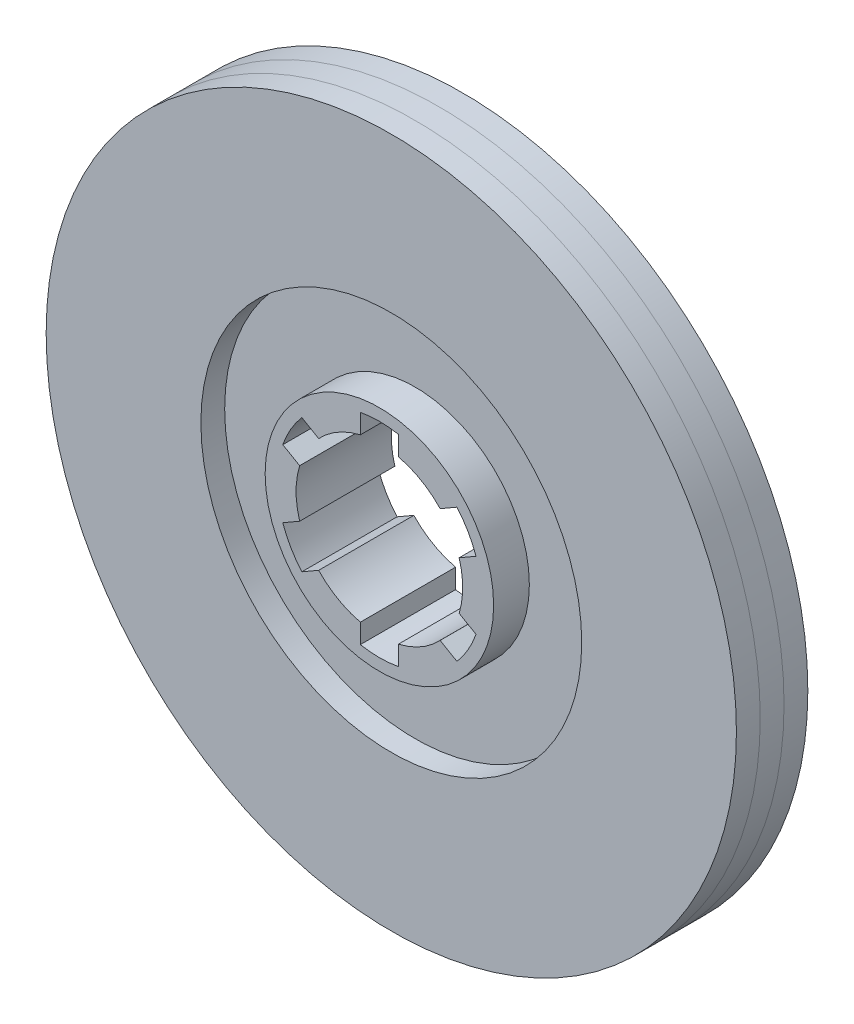
ISO-10303-21;
HEADER;
FILE_DESCRIPTION(('STEP AP214'),'2;1');
FILE_NAME('part.step','',(''),(''),'','','');
FILE_SCHEMA(('AUTOMOTIVE_DESIGN { 1 0 10303 214 1 1 1 1 }'));
ENDSEC;
DATA;
#1=APPLICATION_CONTEXT('core data for automotive mechanical design processes');
#2=APPLICATION_PROTOCOL_DEFINITION('international standard','automotive_design',2000,#1);
#3=PRODUCT_CONTEXT('',#1,'mechanical');
#4=PRODUCT('Part','Part','',(#3));
#5=PRODUCT_RELATED_PRODUCT_CATEGORY('part','',(#4));
#6=PRODUCT_DEFINITION_FORMATION('','',#4);
#7=PRODUCT_DEFINITION_CONTEXT('part definition',#1,'design');
#8=PRODUCT_DEFINITION('design','',#6,#7);
#9=PRODUCT_DEFINITION_SHAPE('','',#8);
#10=(LENGTH_UNIT() NAMED_UNIT(*) SI_UNIT(.MILLI.,.METRE.));
#11=(NAMED_UNIT(*) PLANE_ANGLE_UNIT() SI_UNIT($,.RADIAN.));
#12=(NAMED_UNIT(*) SI_UNIT($,.STERADIAN.) SOLID_ANGLE_UNIT());
#13=UNCERTAINTY_MEASURE_WITH_UNIT(LENGTH_MEASURE(1.E-05),#10,'distance_accuracy_value','');
#14=(GEOMETRIC_REPRESENTATION_CONTEXT(3) GLOBAL_UNCERTAINTY_ASSIGNED_CONTEXT((#13)) GLOBAL_UNIT_ASSIGNED_CONTEXT((#10,
#11,#12)) REPRESENTATION_CONTEXT('',''));
#15=CARTESIAN_POINT('',(0.,0.,0.));
#16=DIRECTION('',(0.,0.,1.));
#17=DIRECTION('',(1.,0.,0.));
#18=AXIS2_PLACEMENT_3D('',#15,#16,#17);
#19=CARTESIAN_POINT('',(0.,0.,-7.5));
#20=DIRECTION('',(0.,0.,-1.));
#21=DIRECTION('',(1.,0.,0.));
#22=AXIS2_PLACEMENT_3D('',#19,#20,#21);
#23=PLANE('',#22);
#24=CARTESIAN_POINT('',(0.,0.,-7.5));
#25=DIRECTION('',(0.,0.,1.));
#26=DIRECTION('',(1.,0.,0.));
#27=AXIS2_PLACEMENT_3D('',#24,#25,#26);
#28=CIRCLE('',#27,72.5);
#29=CARTESIAN_POINT('',(72.5,0.,-7.5));
#30=VERTEX_POINT('',#29);
#31=EDGE_CURVE('E13',#30,#30,#28,.T.);
#32=ORIENTED_EDGE('',*,*,#31,.F.);
#33=EDGE_LOOP('',(#32));
#34=FACE_BOUND('',#33,.T.);
#35=CARTESIAN_POINT('',(0.,0.,-7.5));
#36=DIRECTION('',(0.,0.,1.));
#37=DIRECTION('',(1.,0.,0.));
#38=AXIS2_PLACEMENT_3D('',#35,#36,#37);
#39=CIRCLE('',#38,40.);
#40=CARTESIAN_POINT('',(40.,0.,-7.5));
#41=VERTEX_POINT('',#40);
#42=EDGE_CURVE('E71',#41,#41,#39,.T.);
#43=ORIENTED_EDGE('',*,*,#42,.T.);
#44=EDGE_LOOP('',(#43));
#45=FACE_BOUND('',#44,.T.);
#46=ADVANCED_FACE('F60',(#34,#45),#23,.T.);
#47=CARTESIAN_POINT('',(0.,0.,-2.5));
#48=DIRECTION('',(0.,0.,-1.));
#49=DIRECTION('',(1.,0.,0.));
#50=AXIS2_PLACEMENT_3D('',#47,#48,#49);
#51=PLANE('',#50);
#52=CARTESIAN_POINT('',(0.,0.,-2.5));
#53=DIRECTION('',(0.,0.,1.));
#54=DIRECTION('',(1.,0.,0.));
#55=AXIS2_PLACEMENT_3D('',#52,#53,#54);
#56=CIRCLE('',#55,72.5);
#57=CARTESIAN_POINT('',(72.5,0.,-2.5));
#58=VERTEX_POINT('',#57);
#59=EDGE_CURVE('E64',#58,#58,#56,.T.);
#60=ORIENTED_EDGE('',*,*,#59,.T.);
#61=EDGE_LOOP('',(#60));
#62=FACE_BOUND('',#61,.T.);
#63=CARTESIAN_POINT('',(0.,0.,-2.5));
#64=DIRECTION('',(0.,0.,1.));
#65=DIRECTION('',(1.,0.,0.));
#66=AXIS2_PLACEMENT_3D('',#63,#64,#65);
#67=CIRCLE('',#66,40.);
#68=CARTESIAN_POINT('',(40.,0.,-2.5));
#69=VERTEX_POINT('',#68);
#70=EDGE_CURVE('E73',#69,#69,#67,.T.);
#71=ORIENTED_EDGE('',*,*,#70,.F.);
#72=EDGE_LOOP('',(#71));
#73=FACE_BOUND('',#72,.T.);
#74=ADVANCED_FACE('F86',(#62,#73),#51,.F.);
#75=CARTESIAN_POINT('',(0.,0.,-7.5));
#76=DIRECTION('',(0.,0.,1.));
#77=DIRECTION('',(-1.,0.,0.));
#78=AXIS2_PLACEMENT_3D('',#75,#76,#77);
#79=CYLINDRICAL_SURFACE('',#78,72.5);
#80=ORIENTED_EDGE('',*,*,#31,.T.);
#81=EDGE_LOOP('',(#80));
#82=FACE_BOUND('',#81,.T.);
#83=ORIENTED_EDGE('',*,*,#59,.F.);
#84=EDGE_LOOP('',(#83));
#85=FACE_BOUND('',#84,.T.);
#86=ADVANCED_FACE('F62',(#82,#85),#79,.T.);
#87=CARTESIAN_POINT('',(0.,0.,-7.5));
#88=DIRECTION('',(0.,0.,1.));
#89=DIRECTION('',(-1.,0.,0.));
#90=AXIS2_PLACEMENT_3D('',#87,#88,#89);
#91=CYLINDRICAL_SURFACE('',#90,40.);
#92=ORIENTED_EDGE('',*,*,#42,.F.);
#93=EDGE_LOOP('',(#92));
#94=FACE_BOUND('',#93,.T.);
#95=ORIENTED_EDGE('',*,*,#70,.T.);
#96=EDGE_LOOP('',(#95));
#97=FACE_BOUND('',#96,.T.);
#98=ADVANCED_FACE('F80',(#94,#97),#91,.F.);
#99=CLOSED_SHELL('',(#46,#74,#86,#98));
#100=MANIFOLD_SOLID_BREP('B2',#99);
#101=CARTESIAN_POINT('',(0.,0.,7.5));
#102=DIRECTION('',(0.,0.,1.));
#103=DIRECTION('',(1.,0.,0.));
#104=AXIS2_PLACEMENT_3D('',#101,#102,#103);
#105=PLANE('',#104);
#106=CARTESIAN_POINT('',(0.,0.,7.5));
#107=DIRECTION('',(0.,0.,1.));
#108=DIRECTION('',(1.,0.,0.));
#109=AXIS2_PLACEMENT_3D('',#106,#107,#108);
#110=CIRCLE('',#109,72.5);
#111=CARTESIAN_POINT('',(72.5,0.,7.5));
#112=VERTEX_POINT('',#111);
#113=EDGE_CURVE('E59',#112,#112,#110,.T.);
#114=ORIENTED_EDGE('',*,*,#113,.T.);
#115=EDGE_LOOP('',(#114));
#116=FACE_BOUND('',#115,.T.);
#117=CARTESIAN_POINT('',(0.,0.,7.5));
#118=DIRECTION('',(0.,0.,1.));
#119=DIRECTION('',(1.,0.,0.));
#120=AXIS2_PLACEMENT_3D('',#117,#118,#119);
#121=CIRCLE('',#120,40.);
#122=CARTESIAN_POINT('',(40.,0.,7.5));
#123=VERTEX_POINT('',#122);
#124=EDGE_CURVE('E168',#123,#123,#121,.T.);
#125=ORIENTED_EDGE('',*,*,#124,.F.);
#126=EDGE_LOOP('',(#125));
#127=FACE_BOUND('',#126,.T.);
#128=ADVANCED_FACE('F157',(#116,#127),#105,.T.);
#129=CARTESIAN_POINT('',(0.,0.,2.5));
#130=DIRECTION('',(0.,0.,1.));
#131=DIRECTION('',(1.,0.,0.));
#132=AXIS2_PLACEMENT_3D('',#129,#130,#131);
#133=PLANE('',#132);
#134=CARTESIAN_POINT('',(0.,0.,2.5));
#135=DIRECTION('',(0.,0.,1.));
#136=DIRECTION('',(1.,0.,0.));
#137=AXIS2_PLACEMENT_3D('',#134,#135,#136);
#138=CIRCLE('',#137,72.5);
#139=CARTESIAN_POINT('',(72.5,0.,2.5));
#140=VERTEX_POINT('',#139);
#141=EDGE_CURVE('E161',#140,#140,#138,.T.);
#142=ORIENTED_EDGE('',*,*,#141,.F.);
#143=EDGE_LOOP('',(#142));
#144=FACE_BOUND('',#143,.T.);
#145=CARTESIAN_POINT('',(0.,0.,2.5));
#146=DIRECTION('',(0.,0.,1.));
#147=DIRECTION('',(1.,0.,0.));
#148=AXIS2_PLACEMENT_3D('',#145,#146,#147);
#149=CIRCLE('',#148,40.);
#150=CARTESIAN_POINT('',(40.,0.,2.5));
#151=VERTEX_POINT('',#150);
#152=EDGE_CURVE('E170',#151,#151,#149,.T.);
#153=ORIENTED_EDGE('',*,*,#152,.T.);
#154=EDGE_LOOP('',(#153));
#155=FACE_BOUND('',#154,.T.);
#156=ADVANCED_FACE('F180',(#144,#155),#133,.F.);
#157=CARTESIAN_POINT('',(0.,0.,7.5));
#158=DIRECTION('',(0.,0.,-1.));
#159=DIRECTION('',(-1.,0.,0.));
#160=AXIS2_PLACEMENT_3D('',#157,#158,#159);
#161=CYLINDRICAL_SURFACE('',#160,72.5);
#162=ORIENTED_EDGE('',*,*,#113,.F.);
#163=EDGE_LOOP('',(#162));
#164=FACE_BOUND('',#163,.T.);
#165=ORIENTED_EDGE('',*,*,#141,.T.);
#166=EDGE_LOOP('',(#165));
#167=FACE_BOUND('',#166,.T.);
#168=ADVANCED_FACE('F159',(#164,#167),#161,.T.);
#169=CARTESIAN_POINT('',(0.,0.,7.5));
#170=DIRECTION('',(0.,0.,-1.));
#171=DIRECTION('',(-1.,0.,0.));
#172=AXIS2_PLACEMENT_3D('',#169,#170,#171);
#173=CYLINDRICAL_SURFACE('',#172,40.);
#174=ORIENTED_EDGE('',*,*,#124,.T.);
#175=EDGE_LOOP('',(#174));
#176=FACE_BOUND('',#175,.T.);
#177=ORIENTED_EDGE('',*,*,#152,.F.);
#178=EDGE_LOOP('',(#177));
#179=FACE_BOUND('',#178,.T.);
#180=ADVANCED_FACE('F176',(#176,#179),#173,.F.);
#181=CLOSED_SHELL('',(#128,#156,#168,#180));
#182=MANIFOLD_SOLID_BREP('B8',#181);
#183=CARTESIAN_POINT('',(0.,0.,2.5));
#184=DIRECTION('',(0.,0.,-1.));
#185=DIRECTION('',(-1.,0.,0.));
#186=AXIS2_PLACEMENT_3D('',#183,#184,#185);
#187=CYLINDRICAL_SURFACE('',#186,72.5);
#188=CARTESIAN_POINT('',(0.,0.,2.5));
#189=DIRECTION('',(0.,0.,1.));
#190=DIRECTION('',(1.,0.,0.));
#191=AXIS2_PLACEMENT_3D('',#188,#189,#190);
#192=CIRCLE('',#191,72.5);
#193=CARTESIAN_POINT('',(72.5,0.,2.5));
#194=VERTEX_POINT('',#193);
#195=EDGE_CURVE('E231',#194,#194,#192,.T.);
#196=ORIENTED_EDGE('',*,*,#195,.F.);
#197=EDGE_LOOP('',(#196));
#198=FACE_BOUND('',#197,.T.);
#199=CARTESIAN_POINT('',(0.,0.,-2.5));
#200=DIRECTION('',(0.,0.,1.));
#201=DIRECTION('',(1.,0.,0.));
#202=AXIS2_PLACEMENT_3D('',#199,#200,#201);
#203=CIRCLE('',#202,72.5);
#204=CARTESIAN_POINT('',(72.5,0.,-2.5));
#205=VERTEX_POINT('',#204);
#206=EDGE_CURVE('E584',#205,#205,#203,.T.);
#207=ORIENTED_EDGE('',*,*,#206,.T.);
#208=EDGE_LOOP('',(#207));
#209=FACE_BOUND('',#208,.T.);
#210=ADVANCED_FACE('F224',(#198,#209),#187,.T.);
#211=CARTESIAN_POINT('',(0.,0.,2.5));
#212=DIRECTION('',(0.,0.,1.));
#213=DIRECTION('',(1.,0.,0.));
#214=AXIS2_PLACEMENT_3D('',#211,#212,#213);
#215=PLANE('',#214);
#216=CARTESIAN_POINT('',(0.,0.,2.5));
#217=DIRECTION('',(0.,0.,1.));
#218=DIRECTION('',(1.,0.,0.));
#219=AXIS2_PLACEMENT_3D('',#216,#217,#218);
#220=CIRCLE('',#219,24.);
#221=CARTESIAN_POINT('',(24.,0.,2.5));
#222=VERTEX_POINT('',#221);
#223=EDGE_CURVE('E579',#222,#222,#220,.F.);
#224=ORIENTED_EDGE('',*,*,#223,.T.);
#225=EDGE_LOOP('',(#224));
#226=FACE_BOUND('',#225,.T.);
#227=ORIENTED_EDGE('',*,*,#195,.T.);
#228=EDGE_LOOP('',(#227));
#229=FACE_BOUND('',#228,.T.);
#230=ADVANCED_FACE('F592',(#226,#229),#215,.T.);
#231=CARTESIAN_POINT('',(0.,0.,-2.5));
#232=DIRECTION('',(0.,0.,1.));
#233=DIRECTION('',(1.,0.,0.));
#234=AXIS2_PLACEMENT_3D('',#231,#232,#233);
#235=PLANE('',#234);
#236=CARTESIAN_POINT('',(0.,0.,-2.5));
#237=DIRECTION('',(0.,0.,1.));
#238=DIRECTION('',(1.,0.,0.));
#239=AXIS2_PLACEMENT_3D('',#236,#237,#238);
#240=CIRCLE('',#239,24.);
#241=CARTESIAN_POINT('',(24.,0.,-2.5));
#242=VERTEX_POINT('',#241);
#243=EDGE_CURVE('E155',#242,#242,#240,.F.);
#244=ORIENTED_EDGE('',*,*,#243,.F.);
#245=EDGE_LOOP('',(#244));
#246=FACE_BOUND('',#245,.T.);
#247=ORIENTED_EDGE('',*,*,#206,.F.);
#248=EDGE_LOOP('',(#247));
#249=FACE_BOUND('',#248,.T.);
#250=ADVANCED_FACE('F590',(#246,#249),#235,.F.);
#251=CARTESIAN_POINT('',(0.,0.,-10.));
#252=DIRECTION('',(0.,0.,1.));
#253=DIRECTION('',(1.,0.,0.));
#254=AXIS2_PLACEMENT_3D('',#251,#252,#253);
#255=PLANE('',#254);
#256=DIRECTION('',(-0.866025403784439,-0.5,0.));
#257=VECTOR('',#256,1.);
#258=CARTESIAN_POINT('',(-1.99999999999996,3.46410161513768,-10.));
#259=LINE('',#258,#257);
#260=CARTESIAN_POINT('',(16.2944663764758,14.0264167022765,-10.));
#261=VERTEX_POINT('',#260);
#262=CARTESIAN_POINT('',(12.7542366796796,11.9824641338381,-10.));
#263=VERTEX_POINT('',#262);
#264=EDGE_CURVE('E397',#261,#263,#259,.T.);
#265=ORIENTED_EDGE('',*,*,#264,.T.);
#266=CARTESIAN_POINT('',(0.,0.,-10.));
#267=DIRECTION('',(0.,0.,1.));
#268=DIRECTION('',(1.,0.,0.));
#269=AXIS2_PLACEMENT_3D('',#266,#267,#268);
#270=CIRCLE('',#269,17.5000000000001);
#271=CARTESIAN_POINT('',(4.00000000000001,17.0367250374008,-10.));
#272=VERTEX_POINT('',#271);
#273=EDGE_CURVE('E392',#263,#272,#270,.T.);
#274=ORIENTED_EDGE('',*,*,#273,.T.);
#275=DIRECTION('',(0.,-1.,0.));
#276=VECTOR('',#275,1.);
#277=CARTESIAN_POINT('',(4.,0.,-10.));
#278=LINE('',#277,#276);
#279=CARTESIAN_POINT('',(4.00000000000001,21.1246301742776,-10.));
#280=VERTEX_POINT('',#279);
#281=EDGE_CURVE('E384',#280,#272,#278,.T.);
#282=ORIENTED_EDGE('',*,*,#281,.F.);
#283=CARTESIAN_POINT('',(0.,0.,-10.));
#284=DIRECTION('',(0.,0.,1.));
#285=DIRECTION('',(1.,0.,0.));
#286=AXIS2_PLACEMENT_3D('',#283,#284,#285);
#287=CIRCLE('',#286,21.5);
#288=CARTESIAN_POINT('',(-4.,21.1246301742776,-10.));
#289=VERTEX_POINT('',#288);
#290=EDGE_CURVE('E238',#280,#289,#287,.T.);
#291=ORIENTED_EDGE('',*,*,#290,.T.);
#292=DIRECTION('',(0.,-1.,0.));
#293=VECTOR('',#292,1.);
#294=CARTESIAN_POINT('',(-3.99999999999998,0.,-10.));
#295=LINE('',#294,#293);
#296=CARTESIAN_POINT('',(-4.,17.0367250374008,-10.));
#297=VERTEX_POINT('',#296);
#298=EDGE_CURVE('E410',#289,#297,#295,.T.);
#299=ORIENTED_EDGE('',*,*,#298,.T.);
#300=CARTESIAN_POINT('',(0.,0.,-10.));
#301=DIRECTION('',(0.,0.,1.));
#302=DIRECTION('',(1.,0.,0.));
#303=AXIS2_PLACEMENT_3D('',#300,#301,#302);
#304=CIRCLE('',#303,17.5);
#305=CARTESIAN_POINT('',(-12.7542366796796,11.9824641338381,-10.));
#306=VERTEX_POINT('',#305);
#307=EDGE_CURVE('E413',#297,#306,#304,.T.);
#308=ORIENTED_EDGE('',*,*,#307,.T.);
#309=DIRECTION('',(0.866025403784424,-0.500000000000026,0.));
#310=VECTOR('',#309,1.);
#311=CARTESIAN_POINT('',(1.99999999999979,3.46410161513715,-10.));
#312=LINE('',#311,#310);
#313=CARTESIAN_POINT('',(-16.2944663764757,14.0264167022766,-10.));
#314=VERTEX_POINT('',#313);
#315=EDGE_CURVE('E416',#314,#306,#312,.T.);
#316=ORIENTED_EDGE('',*,*,#315,.F.);
#317=CARTESIAN_POINT('',(0.,0.,-10.));
#318=DIRECTION('',(0.,0.,1.));
#319=DIRECTION('',(1.,0.,0.));
#320=AXIS2_PLACEMENT_3D('',#317,#318,#319);
#321=CIRCLE('',#320,21.5);
#322=CARTESIAN_POINT('',(-20.2944663764758,7.09821347200095,-10.));
#323=VERTEX_POINT('',#322);
#324=EDGE_CURVE('E418',#314,#323,#321,.T.);
#325=ORIENTED_EDGE('',*,*,#324,.T.);
#326=DIRECTION('',(0.866025403784439,-0.499999999999999,0.));
#327=VECTOR('',#326,1.);
#328=CARTESIAN_POINT('',(-2.00000000000006,-3.46410161513786,-10.));
#329=LINE('',#328,#327);
#330=CARTESIAN_POINT('',(-16.7542366796796,5.05426090356255,-10.));
#331=VERTEX_POINT('',#330);
#332=EDGE_CURVE('E421',#323,#331,#329,.T.);
#333=ORIENTED_EDGE('',*,*,#332,.T.);
#334=CARTESIAN_POINT('',(0.,0.,-10.));
#335=DIRECTION('',(0.,0.,1.));
#336=DIRECTION('',(1.,0.,0.));
#337=AXIS2_PLACEMENT_3D('',#334,#335,#336);
#338=CIRCLE('',#337,17.5000000000001);
#339=CARTESIAN_POINT('',(-16.7542366796795,-5.05426090356286,-10.));
#340=VERTEX_POINT('',#339);
#341=EDGE_CURVE('E424',#331,#340,#338,.T.);
#342=ORIENTED_EDGE('',*,*,#341,.T.);
#343=DIRECTION('',(0.866025403784438,0.500000000000001,0.));
#344=VECTOR('',#343,1.);
#345=CARTESIAN_POINT('',(-1.99999999999993,3.46410161513763,-10.));
#346=LINE('',#345,#344);
#347=CARTESIAN_POINT('',(-20.2944663764757,-7.09821347200126,-10.));
#348=VERTEX_POINT('',#347);
#349=EDGE_CURVE('E427',#348,#340,#346,.T.);
#350=ORIENTED_EDGE('',*,*,#349,.F.);
#351=CARTESIAN_POINT('',(0.,0.,-10.));
#352=DIRECTION('',(0.,0.,1.));
#353=DIRECTION('',(1.,0.,0.));
#354=AXIS2_PLACEMENT_3D('',#351,#352,#353);
#355=CIRCLE('',#354,21.5000000000001);
#356=CARTESIAN_POINT('',(-16.2944663764757,-14.0264167022768,-10.));
#357=VERTEX_POINT('',#356);
#358=EDGE_CURVE('E429',#348,#357,#355,.T.);
#359=ORIENTED_EDGE('',*,*,#358,.T.);
#360=DIRECTION('',(0.866025403784418,0.500000000000036,0.));
#361=VECTOR('',#360,1.);
#362=CARTESIAN_POINT('',(1.99999999999979,-3.46410161513707,-10.));
#363=LINE('',#362,#361);
#364=CARTESIAN_POINT('',(-12.7542366796795,-11.9824641338382,-10.));
#365=VERTEX_POINT('',#364);
#366=EDGE_CURVE('E432',#357,#365,#363,.T.);
#367=ORIENTED_EDGE('',*,*,#366,.T.);
#368=CARTESIAN_POINT('',(0.,0.,-10.));
#369=DIRECTION('',(0.,0.,1.));
#370=DIRECTION('',(1.,0.,0.));
#371=AXIS2_PLACEMENT_3D('',#368,#369,#370);
#372=CIRCLE('',#371,17.5);
#373=CARTESIAN_POINT('',(-4.00000000000001,-17.0367250374008,-10.));
#374=VERTEX_POINT('',#373);
#375=EDGE_CURVE('E435',#365,#374,#372,.T.);
#376=ORIENTED_EDGE('',*,*,#375,.T.);
#377=DIRECTION('',(0.,1.,0.));
#378=VECTOR('',#377,1.);
#379=CARTESIAN_POINT('',(-4.00000000000037,0.,-10.));
#380=LINE('',#379,#378);
#381=CARTESIAN_POINT('',(-3.99999999999992,-21.1246301742778,-10.));
#382=VERTEX_POINT('',#381);
#383=EDGE_CURVE('E438',#382,#374,#380,.T.);
#384=ORIENTED_EDGE('',*,*,#383,.F.);
#385=CARTESIAN_POINT('',(0.,0.,-10.));
#386=DIRECTION('',(0.,0.,1.));
#387=DIRECTION('',(1.,0.,0.));
#388=AXIS2_PLACEMENT_3D('',#385,#386,#387);
#389=CIRCLE('',#388,21.5000000000002);
#390=CARTESIAN_POINT('',(4.00000000000009,-21.1246301742778,-10.));
#391=VERTEX_POINT('',#390);
#392=EDGE_CURVE('E440',#382,#391,#389,.T.);
#393=ORIENTED_EDGE('',*,*,#392,.T.);
#394=DIRECTION('',(0.,1.,0.));
#395=VECTOR('',#394,1.);
#396=CARTESIAN_POINT('',(4.00000000000007,0.,-10.));
#397=LINE('',#396,#395);
#398=CARTESIAN_POINT('',(4.00000000000008,-17.0367250374011,-10.));
#399=VERTEX_POINT('',#398);
#400=EDGE_CURVE('E443',#391,#399,#397,.T.);
#401=ORIENTED_EDGE('',*,*,#400,.T.);
#402=CARTESIAN_POINT('',(0.,0.,-10.));
#403=DIRECTION('',(0.,0.,1.));
#404=DIRECTION('',(1.,0.,0.));
#405=AXIS2_PLACEMENT_3D('',#402,#403,#404);
#406=CIRCLE('',#405,17.5000000000002);
#407=CARTESIAN_POINT('',(12.7542366796797,-11.9824641338383,-10.));
#408=VERTEX_POINT('',#407);
#409=EDGE_CURVE('E446',#399,#408,#406,.T.);
#410=ORIENTED_EDGE('',*,*,#409,.T.);
#411=DIRECTION('',(-0.866025403784439,0.5,0.));
#412=VECTOR('',#411,1.);
#413=CARTESIAN_POINT('',(-2.00000000000002,-3.46410161513779,-10.));
#414=LINE('',#413,#412);
#415=CARTESIAN_POINT('',(16.2944663764759,-14.0264167022767,-10.));
#416=VERTEX_POINT('',#415);
#417=EDGE_CURVE('E449',#416,#408,#414,.T.);
#418=ORIENTED_EDGE('',*,*,#417,.F.);
#419=CARTESIAN_POINT('',(0.,0.,-10.));
#420=DIRECTION('',(0.,0.,1.));
#421=DIRECTION('',(1.,0.,0.));
#422=AXIS2_PLACEMENT_3D('',#419,#420,#421);
#423=CIRCLE('',#422,21.5000000000002);
#424=CARTESIAN_POINT('',(20.2944663764759,-7.09821347200118,-10.));
#425=VERTEX_POINT('',#424);
#426=EDGE_CURVE('E451',#416,#425,#423,.T.);
#427=ORIENTED_EDGE('',*,*,#426,.T.);
#428=DIRECTION('',(-0.866025403784439,0.5,0.));
#429=VECTOR('',#428,1.);
#430=CARTESIAN_POINT('',(1.99999999999998,3.46410161513772,-10.));
#431=LINE('',#430,#429);
#432=CARTESIAN_POINT('',(16.7542366796797,-5.05426090356279,-10.));
#433=VERTEX_POINT('',#432);
#434=EDGE_CURVE('E454',#425,#433,#431,.T.);
#435=ORIENTED_EDGE('',*,*,#434,.T.);
#436=CARTESIAN_POINT('',(0.,0.,-10.));
#437=DIRECTION('',(0.,0.,1.));
#438=DIRECTION('',(1.,0.,0.));
#439=AXIS2_PLACEMENT_3D('',#436,#437,#438);
#440=CIRCLE('',#439,17.5000000000002);
#441=CARTESIAN_POINT('',(16.7542366796796,5.05426090356262,-10.));
#442=VERTEX_POINT('',#441);
#443=EDGE_CURVE('E457',#433,#442,#440,.T.);
#444=ORIENTED_EDGE('',*,*,#443,.T.);
#445=DIRECTION('',(-0.866025403784439,-0.5,0.));
#446=VECTOR('',#445,1.);
#447=CARTESIAN_POINT('',(2.00000000000005,-3.46410161513783,-10.));
#448=LINE('',#447,#446);
#449=CARTESIAN_POINT('',(20.2944663764758,7.09821347200102,-10.));
#450=VERTEX_POINT('',#449);
#451=EDGE_CURVE('E460',#450,#442,#448,.T.);
#452=ORIENTED_EDGE('',*,*,#451,.F.);
#453=CARTESIAN_POINT('',(0.,0.,-10.));
#454=DIRECTION('',(0.,0.,1.));
#455=DIRECTION('',(1.,0.,0.));
#456=AXIS2_PLACEMENT_3D('',#453,#454,#455);
#457=CIRCLE('',#456,21.5000000000001);
#458=EDGE_CURVE('E462',#450,#261,#457,.T.);
#459=ORIENTED_EDGE('',*,*,#458,.T.);
#460=EDGE_LOOP('',(#265,#274,#282,#291,#299,#308,#316,#325,#333,#342,#350,#359,#367,#376,#384,
#393,#401,#410,#418,#427,#435,#444,#452,#459));
#461=FACE_BOUND('',#460,.T.);
#462=CARTESIAN_POINT('',(0.,0.,-10.));
#463=DIRECTION('',(0.,0.,1.));
#464=DIRECTION('',(1.,0.,0.));
#465=AXIS2_PLACEMENT_3D('',#462,#463,#464);
#466=CIRCLE('',#465,24.);
#467=CARTESIAN_POINT('',(24.,0.,-10.));
#468=VERTEX_POINT('',#467);
#469=EDGE_CURVE('E532',#468,#468,#466,.T.);
#470=ORIENTED_EDGE('',*,*,#469,.F.);
#471=EDGE_LOOP('',(#470));
#472=FACE_BOUND('',#471,.T.);
#473=ADVANCED_FACE('F399',(#461,#472),#255,.F.);
#474=CARTESIAN_POINT('',(0.,0.,10.));
#475=DIRECTION('',(0.,0.,-1.));
#476=DIRECTION('',(-1.,0.,0.));
#477=AXIS2_PLACEMENT_3D('',#474,#475,#476);
#478=CYLINDRICAL_SURFACE('',#477,24.);
#479=ORIENTED_EDGE('',*,*,#469,.T.);
#480=EDGE_LOOP('',(#479));
#481=FACE_BOUND('',#480,.T.);
#482=ORIENTED_EDGE('',*,*,#243,.T.);
#483=EDGE_LOOP('',(#482));
#484=FACE_BOUND('',#483,.T.);
#485=ADVANCED_FACE('F598',(#481,#484),#478,.T.);
#486=ORIENTED_EDGE('',*,*,#223,.F.);
#487=EDGE_LOOP('',(#486));
#488=FACE_BOUND('',#487,.T.);
#489=CARTESIAN_POINT('',(0.,0.,10.));
#490=DIRECTION('',(0.,0.,1.));
#491=DIRECTION('',(1.,0.,0.));
#492=AXIS2_PLACEMENT_3D('',#489,#490,#491);
#493=CIRCLE('',#492,24.);
#494=CARTESIAN_POINT('',(24.,0.,10.));
#495=VERTEX_POINT('',#494);
#496=EDGE_CURVE('E576',#495,#495,#493,.T.);
#497=ORIENTED_EDGE('',*,*,#496,.F.);
#498=EDGE_LOOP('',(#497));
#499=FACE_BOUND('',#498,.T.);
#500=ADVANCED_FACE('F627',(#488,#499),#478,.T.);
#501=CARTESIAN_POINT('',(0.,0.,10.));
#502=DIRECTION('',(0.,0.,1.));
#503=DIRECTION('',(1.,0.,0.));
#504=AXIS2_PLACEMENT_3D('',#501,#502,#503);
#505=PLANE('',#504);
#506=CARTESIAN_POINT('',(0.,0.,10.));
#507=DIRECTION('',(0.,0.,1.));
#508=DIRECTION('',(1.,0.,0.));
#509=AXIS2_PLACEMENT_3D('',#506,#507,#508);
#510=CIRCLE('',#509,17.5000000000001);
#511=CARTESIAN_POINT('',(12.7542366796796,11.9824641338381,10.));
#512=VERTEX_POINT('',#511);
#513=CARTESIAN_POINT('',(4.00000000000001,17.0367250374008,10.));
#514=VERTEX_POINT('',#513);
#515=EDGE_CURVE('E246',#512,#514,#510,.T.);
#516=ORIENTED_EDGE('',*,*,#515,.F.);
#517=DIRECTION('',(-0.866025403784439,-0.5,0.));
#518=VECTOR('',#517,1.);
#519=CARTESIAN_POINT('',(-1.99999999999996,3.46410161513768,10.));
#520=LINE('',#519,#518);
#521=CARTESIAN_POINT('',(16.2944663764758,14.0264167022765,10.));
#522=VERTEX_POINT('',#521);
#523=EDGE_CURVE('E403',#522,#512,#520,.T.);
#524=ORIENTED_EDGE('',*,*,#523,.F.);
#525=CARTESIAN_POINT('',(0.,0.,10.));
#526=DIRECTION('',(0.,0.,1.));
#527=DIRECTION('',(1.,0.,0.));
#528=AXIS2_PLACEMENT_3D('',#525,#526,#527);
#529=CIRCLE('',#528,21.5000000000001);
#530=CARTESIAN_POINT('',(20.2944663764758,7.09821347200102,10.));
#531=VERTEX_POINT('',#530);
#532=EDGE_CURVE('E406',#531,#522,#529,.T.);
#533=ORIENTED_EDGE('',*,*,#532,.F.);
#534=DIRECTION('',(-0.866025403784439,-0.5,0.));
#535=VECTOR('',#534,1.);
#536=CARTESIAN_POINT('',(2.00000000000005,-3.46410161513783,10.));
#537=LINE('',#536,#535);
#538=CARTESIAN_POINT('',(16.7542366796796,5.05426090356262,10.));
#539=VERTEX_POINT('',#538);
#540=EDGE_CURVE('E525',#531,#539,#537,.T.);
#541=ORIENTED_EDGE('',*,*,#540,.T.);
#542=CARTESIAN_POINT('',(0.,0.,10.));
#543=DIRECTION('',(0.,0.,1.));
#544=DIRECTION('',(1.,0.,0.));
#545=AXIS2_PLACEMENT_3D('',#542,#543,#544);
#546=CIRCLE('',#545,17.5000000000002);
#547=CARTESIAN_POINT('',(16.7542366796797,-5.05426090356279,10.));
#548=VERTEX_POINT('',#547);
#549=EDGE_CURVE('E522',#548,#539,#546,.T.);
#550=ORIENTED_EDGE('',*,*,#549,.F.);
#551=DIRECTION('',(-0.866025403784439,0.5,0.));
#552=VECTOR('',#551,1.);
#553=CARTESIAN_POINT('',(1.99999999999998,3.46410161513772,10.));
#554=LINE('',#553,#552);
#555=CARTESIAN_POINT('',(20.2944663764759,-7.09821347200118,10.));
#556=VERTEX_POINT('',#555);
#557=EDGE_CURVE('E519',#556,#548,#554,.T.);
#558=ORIENTED_EDGE('',*,*,#557,.F.);
#559=CARTESIAN_POINT('',(0.,0.,10.));
#560=DIRECTION('',(0.,0.,1.));
#561=DIRECTION('',(1.,0.,0.));
#562=AXIS2_PLACEMENT_3D('',#559,#560,#561);
#563=CIRCLE('',#562,21.5000000000002);
#564=CARTESIAN_POINT('',(16.2944663764759,-14.0264167022767,10.));
#565=VERTEX_POINT('',#564);
#566=EDGE_CURVE('E516',#565,#556,#563,.T.);
#567=ORIENTED_EDGE('',*,*,#566,.F.);
#568=DIRECTION('',(-0.866025403784439,0.5,0.));
#569=VECTOR('',#568,1.);
#570=CARTESIAN_POINT('',(-2.00000000000002,-3.46410161513779,10.));
#571=LINE('',#570,#569);
#572=CARTESIAN_POINT('',(12.7542366796797,-11.9824641338383,10.));
#573=VERTEX_POINT('',#572);
#574=EDGE_CURVE('E513',#565,#573,#571,.T.);
#575=ORIENTED_EDGE('',*,*,#574,.T.);
#576=CARTESIAN_POINT('',(0.,0.,10.));
#577=DIRECTION('',(0.,0.,1.));
#578=DIRECTION('',(1.,0.,0.));
#579=AXIS2_PLACEMENT_3D('',#576,#577,#578);
#580=CIRCLE('',#579,17.5000000000002);
#581=CARTESIAN_POINT('',(4.00000000000008,-17.0367250374011,10.));
#582=VERTEX_POINT('',#581);
#583=EDGE_CURVE('E510',#582,#573,#580,.T.);
#584=ORIENTED_EDGE('',*,*,#583,.F.);
#585=DIRECTION('',(0.,1.,0.));
#586=VECTOR('',#585,1.);
#587=CARTESIAN_POINT('',(4.00000000000007,0.,10.));
#588=LINE('',#587,#586);
#589=CARTESIAN_POINT('',(4.00000000000009,-21.1246301742778,10.));
#590=VERTEX_POINT('',#589);
#591=EDGE_CURVE('E507',#590,#582,#588,.T.);
#592=ORIENTED_EDGE('',*,*,#591,.F.);
#593=CARTESIAN_POINT('',(0.,0.,10.));
#594=DIRECTION('',(0.,0.,1.));
#595=DIRECTION('',(1.,0.,0.));
#596=AXIS2_PLACEMENT_3D('',#593,#594,#595);
#597=CIRCLE('',#596,21.5000000000002);
#598=CARTESIAN_POINT('',(-3.99999999999992,-21.1246301742778,10.));
#599=VERTEX_POINT('',#598);
#600=EDGE_CURVE('E504',#599,#590,#597,.T.);
#601=ORIENTED_EDGE('',*,*,#600,.F.);
#602=DIRECTION('',(0.,1.,0.));
#603=VECTOR('',#602,1.);
#604=CARTESIAN_POINT('',(-4.00000000000037,0.,10.));
#605=LINE('',#604,#603);
#606=CARTESIAN_POINT('',(-4.00000000000001,-17.0367250374008,10.));
#607=VERTEX_POINT('',#606);
#608=EDGE_CURVE('E501',#599,#607,#605,.T.);
#609=ORIENTED_EDGE('',*,*,#608,.T.);
#610=CARTESIAN_POINT('',(0.,0.,10.));
#611=DIRECTION('',(0.,0.,1.));
#612=DIRECTION('',(1.,0.,0.));
#613=AXIS2_PLACEMENT_3D('',#610,#611,#612);
#614=CIRCLE('',#613,17.5);
#615=CARTESIAN_POINT('',(-12.7542366796795,-11.9824641338382,10.));
#616=VERTEX_POINT('',#615);
#617=EDGE_CURVE('E498',#616,#607,#614,.T.);
#618=ORIENTED_EDGE('',*,*,#617,.F.);
#619=DIRECTION('',(0.866025403784418,0.500000000000036,0.));
#620=VECTOR('',#619,1.);
#621=CARTESIAN_POINT('',(1.99999999999979,-3.46410161513707,10.));
#622=LINE('',#621,#620);
#623=CARTESIAN_POINT('',(-16.2944663764757,-14.0264167022768,10.));
#624=VERTEX_POINT('',#623);
#625=EDGE_CURVE('E495',#624,#616,#622,.T.);
#626=ORIENTED_EDGE('',*,*,#625,.F.);
#627=CARTESIAN_POINT('',(0.,0.,10.));
#628=DIRECTION('',(0.,0.,1.));
#629=DIRECTION('',(1.,0.,0.));
#630=AXIS2_PLACEMENT_3D('',#627,#628,#629);
#631=CIRCLE('',#630,21.5000000000001);
#632=CARTESIAN_POINT('',(-20.2944663764757,-7.09821347200126,10.));
#633=VERTEX_POINT('',#632);
#634=EDGE_CURVE('E492',#633,#624,#631,.T.);
#635=ORIENTED_EDGE('',*,*,#634,.F.);
#636=DIRECTION('',(0.866025403784438,0.500000000000001,0.));
#637=VECTOR('',#636,1.);
#638=CARTESIAN_POINT('',(-1.99999999999993,3.46410161513763,10.));
#639=LINE('',#638,#637);
#640=CARTESIAN_POINT('',(-16.7542366796795,-5.05426090356286,10.));
#641=VERTEX_POINT('',#640);
#642=EDGE_CURVE('E489',#633,#641,#639,.T.);
#643=ORIENTED_EDGE('',*,*,#642,.T.);
#644=CARTESIAN_POINT('',(0.,0.,10.));
#645=DIRECTION('',(0.,0.,1.));
#646=DIRECTION('',(1.,0.,0.));
#647=AXIS2_PLACEMENT_3D('',#644,#645,#646);
#648=CIRCLE('',#647,17.5000000000001);
#649=CARTESIAN_POINT('',(-16.7542366796796,5.05426090356255,10.));
#650=VERTEX_POINT('',#649);
#651=EDGE_CURVE('E486',#650,#641,#648,.T.);
#652=ORIENTED_EDGE('',*,*,#651,.F.);
#653=DIRECTION('',(0.866025403784439,-0.499999999999999,0.));
#654=VECTOR('',#653,1.);
#655=CARTESIAN_POINT('',(-2.00000000000006,-3.46410161513786,10.));
#656=LINE('',#655,#654);
#657=CARTESIAN_POINT('',(-20.2944663764758,7.09821347200095,10.));
#658=VERTEX_POINT('',#657);
#659=EDGE_CURVE('E483',#658,#650,#656,.T.);
#660=ORIENTED_EDGE('',*,*,#659,.F.);
#661=CARTESIAN_POINT('',(0.,0.,10.));
#662=DIRECTION('',(0.,0.,1.));
#663=DIRECTION('',(1.,0.,0.));
#664=AXIS2_PLACEMENT_3D('',#661,#662,#663);
#665=CIRCLE('',#664,21.5);
#666=CARTESIAN_POINT('',(-16.2944663764757,14.0264167022766,10.));
#667=VERTEX_POINT('',#666);
#668=EDGE_CURVE('E480',#667,#658,#665,.T.);
#669=ORIENTED_EDGE('',*,*,#668,.F.);
#670=DIRECTION('',(0.866025403784424,-0.500000000000026,0.));
#671=VECTOR('',#670,1.);
#672=CARTESIAN_POINT('',(1.99999999999979,3.46410161513715,10.));
#673=LINE('',#672,#671);
#674=CARTESIAN_POINT('',(-12.7542366796796,11.9824641338381,10.));
#675=VERTEX_POINT('',#674);
#676=EDGE_CURVE('E477',#667,#675,#673,.T.);
#677=ORIENTED_EDGE('',*,*,#676,.T.);
#678=CARTESIAN_POINT('',(0.,0.,10.));
#679=DIRECTION('',(0.,0.,1.));
#680=DIRECTION('',(1.,0.,0.));
#681=AXIS2_PLACEMENT_3D('',#678,#679,#680);
#682=CIRCLE('',#681,17.5);
#683=CARTESIAN_POINT('',(-4.,17.0367250374008,10.));
#684=VERTEX_POINT('',#683);
#685=EDGE_CURVE('E474',#684,#675,#682,.T.);
#686=ORIENTED_EDGE('',*,*,#685,.F.);
#687=DIRECTION('',(0.,-1.,0.));
#688=VECTOR('',#687,1.);
#689=CARTESIAN_POINT('',(-3.99999999999998,0.,10.));
#690=LINE('',#689,#688);
#691=CARTESIAN_POINT('',(-4.,21.1246301742776,10.));
#692=VERTEX_POINT('',#691);
#693=EDGE_CURVE('E471',#692,#684,#690,.T.);
#694=ORIENTED_EDGE('',*,*,#693,.F.);
#695=CARTESIAN_POINT('',(0.,0.,10.));
#696=DIRECTION('',(0.,0.,1.));
#697=DIRECTION('',(1.,0.,0.));
#698=AXIS2_PLACEMENT_3D('',#695,#696,#697);
#699=CIRCLE('',#698,21.5);
#700=CARTESIAN_POINT('',(4.00000000000001,21.1246301742776,10.));
#701=VERTEX_POINT('',#700);
#702=EDGE_CURVE('E468',#701,#692,#699,.T.);
#703=ORIENTED_EDGE('',*,*,#702,.F.);
#704=DIRECTION('',(0.,-1.,0.));
#705=VECTOR('',#704,1.);
#706=CARTESIAN_POINT('',(4.,0.,10.));
#707=LINE('',#706,#705);
#708=EDGE_CURVE('E466',#701,#514,#707,.T.);
#709=ORIENTED_EDGE('',*,*,#708,.T.);
#710=EDGE_LOOP('',(#516,#524,#533,#541,#550,#558,#567,#575,#584,#592,#601,#609,#618,#626,#635,
#643,#652,#660,#669,#677,#686,#694,#703,#709));
#711=FACE_BOUND('',#710,.T.);
#712=ORIENTED_EDGE('',*,*,#496,.T.);
#713=EDGE_LOOP('',(#712));
#714=FACE_BOUND('',#713,.T.);
#715=ADVANCED_FACE('F637',(#711,#714),#505,.T.);
#716=CARTESIAN_POINT('',(0.,0.,-10.));
#717=DIRECTION('',(0.,0.,1.));
#718=DIRECTION('',(1.,0.,0.));
#719=AXIS2_PLACEMENT_3D('',#716,#717,#718);
#720=CYLINDRICAL_SURFACE('',#719,17.5000000000001);
#721=ORIENTED_EDGE('',*,*,#515,.T.);
#722=DIRECTION('',(0.,0.,1.));
#723=VECTOR('',#722,1.);
#724=CARTESIAN_POINT('',(4.00000000000001,17.0367250374008,-10.));
#725=LINE('',#724,#723);
#726=EDGE_CURVE('E387',#272,#514,#725,.T.);
#727=ORIENTED_EDGE('',*,*,#726,.F.);
#728=ORIENTED_EDGE('',*,*,#273,.F.);
#729=DIRECTION('',(0.,0.,1.));
#730=VECTOR('',#729,1.);
#731=CARTESIAN_POINT('',(12.7542366796796,11.9824641338381,-10.));
#732=LINE('',#731,#730);
#733=EDGE_CURVE('E530',#263,#512,#732,.T.);
#734=ORIENTED_EDGE('',*,*,#733,.T.);
#735=EDGE_LOOP('',(#721,#727,#728,#734));
#736=FACE_BOUND('',#735,.T.);
#737=ADVANCED_FACE('F395',(#736),#720,.F.);
#738=CARTESIAN_POINT('',(-1.99999999999996,3.46410161513768,-10.));
#739=DIRECTION('',(-0.5,0.866025403784438,0.));
#740=DIRECTION('',(-0.866025403784438,-0.5,0.));
#741=AXIS2_PLACEMENT_3D('',#738,#739,#740);
#742=PLANE('',#741);
#743=ORIENTED_EDGE('',*,*,#523,.T.);
#744=ORIENTED_EDGE('',*,*,#733,.F.);
#745=ORIENTED_EDGE('',*,*,#264,.F.);
#746=DIRECTION('',(0.,0.,1.));
#747=VECTOR('',#746,1.);
#748=CARTESIAN_POINT('',(16.2944663764758,14.0264167022765,-10.));
#749=LINE('',#748,#747);
#750=EDGE_CURVE('E533',#261,#522,#749,.T.);
#751=ORIENTED_EDGE('',*,*,#750,.T.);
#752=EDGE_LOOP('',(#743,#744,#745,#751));
#753=FACE_BOUND('',#752,.T.);
#754=ADVANCED_FACE('F660',(#753),#742,.F.);
#755=CARTESIAN_POINT('',(0.,0.,-10.));
#756=DIRECTION('',(0.,0.,1.));
#757=DIRECTION('',(1.,0.,0.));
#758=AXIS2_PLACEMENT_3D('',#755,#756,#757);
#759=CYLINDRICAL_SURFACE('',#758,21.5000000000001);
#760=ORIENTED_EDGE('',*,*,#532,.T.);
#761=ORIENTED_EDGE('',*,*,#750,.F.);
#762=ORIENTED_EDGE('',*,*,#458,.F.);
#763=DIRECTION('',(0.,0.,1.));
#764=VECTOR('',#763,1.);
#765=CARTESIAN_POINT('',(20.2944663764758,7.09821347200102,-10.));
#766=LINE('',#765,#764);
#767=EDGE_CURVE('E535',#450,#531,#766,.T.);
#768=ORIENTED_EDGE('',*,*,#767,.T.);
#769=EDGE_LOOP('',(#760,#761,#762,#768));
#770=FACE_BOUND('',#769,.T.);
#771=ADVANCED_FACE('F669',(#770),#759,.F.);
#772=CARTESIAN_POINT('',(2.00000000000005,-3.46410161513783,-10.));
#773=DIRECTION('',(-0.5,0.866025403784438,0.));
#774=DIRECTION('',(-0.866025403784438,-0.5,0.));
#775=AXIS2_PLACEMENT_3D('',#772,#773,#774);
#776=PLANE('',#775);
#777=ORIENTED_EDGE('',*,*,#540,.F.);
#778=ORIENTED_EDGE('',*,*,#767,.F.);
#779=ORIENTED_EDGE('',*,*,#451,.T.);
#780=DIRECTION('',(0.,0.,1.));
#781=VECTOR('',#780,1.);
#782=CARTESIAN_POINT('',(16.7542366796796,5.05426090356262,-10.));
#783=LINE('',#782,#781);
#784=EDGE_CURVE('E537',#442,#539,#783,.T.);
#785=ORIENTED_EDGE('',*,*,#784,.T.);
#786=EDGE_LOOP('',(#777,#778,#779,#785));
#787=FACE_BOUND('',#786,.T.);
#788=ADVANCED_FACE('F679',(#787),#776,.T.);
#789=CARTESIAN_POINT('',(0.,0.,-10.));
#790=DIRECTION('',(0.,0.,1.));
#791=DIRECTION('',(1.,0.,0.));
#792=AXIS2_PLACEMENT_3D('',#789,#790,#791);
#793=CYLINDRICAL_SURFACE('',#792,17.5000000000002);
#794=ORIENTED_EDGE('',*,*,#549,.T.);
#795=ORIENTED_EDGE('',*,*,#784,.F.);
#796=ORIENTED_EDGE('',*,*,#443,.F.);
#797=DIRECTION('',(0.,0.,1.));
#798=VECTOR('',#797,1.);
#799=CARTESIAN_POINT('',(16.7542366796797,-5.05426090356279,-10.));
#800=LINE('',#799,#798);
#801=EDGE_CURVE('E539',#433,#548,#800,.T.);
#802=ORIENTED_EDGE('',*,*,#801,.T.);
#803=EDGE_LOOP('',(#794,#795,#796,#802));
#804=FACE_BOUND('',#803,.T.);
#805=ADVANCED_FACE('F689',(#804),#793,.F.);
#806=CARTESIAN_POINT('',(1.99999999999998,3.46410161513772,-10.));
#807=DIRECTION('',(0.5,0.866025403784439,0.));
#808=DIRECTION('',(-0.866025403784439,0.5,0.));
#809=AXIS2_PLACEMENT_3D('',#806,#807,#808);
#810=PLANE('',#809);
#811=ORIENTED_EDGE('',*,*,#557,.T.);
#812=ORIENTED_EDGE('',*,*,#801,.F.);
#813=ORIENTED_EDGE('',*,*,#434,.F.);
#814=DIRECTION('',(0.,0.,1.));
#815=VECTOR('',#814,1.);
#816=CARTESIAN_POINT('',(20.2944663764759,-7.09821347200118,-10.));
#817=LINE('',#816,#815);
#818=EDGE_CURVE('E541',#425,#556,#817,.T.);
#819=ORIENTED_EDGE('',*,*,#818,.T.);
#820=EDGE_LOOP('',(#811,#812,#813,#819));
#821=FACE_BOUND('',#820,.T.);
#822=ADVANCED_FACE('F699',(#821),#810,.F.);
#823=CARTESIAN_POINT('',(0.,0.,-10.));
#824=DIRECTION('',(0.,0.,1.));
#825=DIRECTION('',(1.,0.,0.));
#826=AXIS2_PLACEMENT_3D('',#823,#824,#825);
#827=CYLINDRICAL_SURFACE('',#826,21.5000000000002);
#828=ORIENTED_EDGE('',*,*,#566,.T.);
#829=ORIENTED_EDGE('',*,*,#818,.F.);
#830=ORIENTED_EDGE('',*,*,#426,.F.);
#831=DIRECTION('',(0.,0.,1.));
#832=VECTOR('',#831,1.);
#833=CARTESIAN_POINT('',(16.2944663764759,-14.0264167022767,-10.));
#834=LINE('',#833,#832);
#835=EDGE_CURVE('E543',#416,#565,#834,.T.);
#836=ORIENTED_EDGE('',*,*,#835,.T.);
#837=EDGE_LOOP('',(#828,#829,#830,#836));
#838=FACE_BOUND('',#837,.T.);
#839=ADVANCED_FACE('F709',(#838),#827,.F.);
#840=CARTESIAN_POINT('',(-2.00000000000002,-3.46410161513779,-10.));
#841=DIRECTION('',(0.5,0.866025403784439,0.));
#842=DIRECTION('',(-0.866025403784439,0.5,0.));
#843=AXIS2_PLACEMENT_3D('',#840,#841,#842);
#844=PLANE('',#843);
#845=ORIENTED_EDGE('',*,*,#574,.F.);
#846=ORIENTED_EDGE('',*,*,#835,.F.);
#847=ORIENTED_EDGE('',*,*,#417,.T.);
#848=DIRECTION('',(0.,0.,1.));
#849=VECTOR('',#848,1.);
#850=CARTESIAN_POINT('',(12.7542366796797,-11.9824641338383,-10.));
#851=LINE('',#850,#849);
#852=EDGE_CURVE('E545',#408,#573,#851,.T.);
#853=ORIENTED_EDGE('',*,*,#852,.T.);
#854=EDGE_LOOP('',(#845,#846,#847,#853));
#855=FACE_BOUND('',#854,.T.);
#856=ADVANCED_FACE('F719',(#855),#844,.T.);
#857=CARTESIAN_POINT('',(0.,0.,-10.));
#858=DIRECTION('',(0.,0.,1.));
#859=DIRECTION('',(1.,0.,0.));
#860=AXIS2_PLACEMENT_3D('',#857,#858,#859);
#861=CYLINDRICAL_SURFACE('',#860,17.5000000000002);
#862=ORIENTED_EDGE('',*,*,#583,.T.);
#863=ORIENTED_EDGE('',*,*,#852,.F.);
#864=ORIENTED_EDGE('',*,*,#409,.F.);
#865=DIRECTION('',(0.,0.,1.));
#866=VECTOR('',#865,1.);
#867=CARTESIAN_POINT('',(4.00000000000008,-17.0367250374011,-10.));
#868=LINE('',#867,#866);
#869=EDGE_CURVE('E547',#399,#582,#868,.T.);
#870=ORIENTED_EDGE('',*,*,#869,.T.);
#871=EDGE_LOOP('',(#862,#863,#864,#870));
#872=FACE_BOUND('',#871,.T.);
#873=ADVANCED_FACE('F729',(#872),#861,.F.);
#874=CARTESIAN_POINT('',(4.00000000000007,0.,-10.));
#875=DIRECTION('',(1.,0.,0.));
#876=DIRECTION('',(0.,1.,0.));
#877=AXIS2_PLACEMENT_3D('',#874,#875,#876);
#878=PLANE('',#877);
#879=ORIENTED_EDGE('',*,*,#591,.T.);
#880=ORIENTED_EDGE('',*,*,#869,.F.);
#881=ORIENTED_EDGE('',*,*,#400,.F.);
#882=DIRECTION('',(0.,0.,1.));
#883=VECTOR('',#882,1.);
#884=CARTESIAN_POINT('',(4.00000000000009,-21.1246301742778,-10.));
#885=LINE('',#884,#883);
#886=EDGE_CURVE('E549',#391,#590,#885,.T.);
#887=ORIENTED_EDGE('',*,*,#886,.T.);
#888=EDGE_LOOP('',(#879,#880,#881,#887));
#889=FACE_BOUND('',#888,.T.);
#890=ADVANCED_FACE('F739',(#889),#878,.F.);
#891=CARTESIAN_POINT('',(0.,0.,-10.));
#892=DIRECTION('',(0.,0.,1.));
#893=DIRECTION('',(1.,0.,0.));
#894=AXIS2_PLACEMENT_3D('',#891,#892,#893);
#895=CYLINDRICAL_SURFACE('',#894,21.5000000000002);
#896=ORIENTED_EDGE('',*,*,#600,.T.);
#897=ORIENTED_EDGE('',*,*,#886,.F.);
#898=ORIENTED_EDGE('',*,*,#392,.F.);
#899=DIRECTION('',(0.,0.,1.));
#900=VECTOR('',#899,1.);
#901=CARTESIAN_POINT('',(-3.99999999999992,-21.1246301742778,-10.));
#902=LINE('',#901,#900);
#903=EDGE_CURVE('E551',#382,#599,#902,.T.);
#904=ORIENTED_EDGE('',*,*,#903,.T.);
#905=EDGE_LOOP('',(#896,#897,#898,#904));
#906=FACE_BOUND('',#905,.T.);
#907=ADVANCED_FACE('F749',(#906),#895,.F.);
#908=CARTESIAN_POINT('',(-4.00000000000037,0.,-10.));
#909=DIRECTION('',(1.,0.,0.));
#910=DIRECTION('',(0.,1.,0.));
#911=AXIS2_PLACEMENT_3D('',#908,#909,#910);
#912=PLANE('',#911);
#913=ORIENTED_EDGE('',*,*,#608,.F.);
#914=ORIENTED_EDGE('',*,*,#903,.F.);
#915=ORIENTED_EDGE('',*,*,#383,.T.);
#916=DIRECTION('',(0.,0.,1.));
#917=VECTOR('',#916,1.);
#918=CARTESIAN_POINT('',(-4.00000000000001,-17.0367250374008,-10.));
#919=LINE('',#918,#917);
#920=EDGE_CURVE('E553',#374,#607,#919,.T.);
#921=ORIENTED_EDGE('',*,*,#920,.T.);
#922=EDGE_LOOP('',(#913,#914,#915,#921));
#923=FACE_BOUND('',#922,.T.);
#924=ADVANCED_FACE('F759',(#923),#912,.T.);
#925=CARTESIAN_POINT('',(0.,0.,-10.));
#926=DIRECTION('',(0.,0.,1.));
#927=DIRECTION('',(1.,0.,0.));
#928=AXIS2_PLACEMENT_3D('',#925,#926,#927);
#929=CYLINDRICAL_SURFACE('',#928,17.5);
#930=ORIENTED_EDGE('',*,*,#617,.T.);
#931=ORIENTED_EDGE('',*,*,#920,.F.);
#932=ORIENTED_EDGE('',*,*,#375,.F.);
#933=DIRECTION('',(0.,0.,1.));
#934=VECTOR('',#933,1.);
#935=CARTESIAN_POINT('',(-12.7542366796795,-11.9824641338382,-10.));
#936=LINE('',#935,#934);
#937=EDGE_CURVE('E555',#365,#616,#936,.T.);
#938=ORIENTED_EDGE('',*,*,#937,.T.);
#939=EDGE_LOOP('',(#930,#931,#932,#938));
#940=FACE_BOUND('',#939,.T.);
#941=ADVANCED_FACE('F769',(#940),#929,.F.);
#942=CARTESIAN_POINT('',(1.99999999999979,-3.46410161513707,-10.));
#943=DIRECTION('',(0.500000000000036,-0.866025403784418,0.));
#944=DIRECTION('',(0.866025403784418,0.500000000000036,0.));
#945=AXIS2_PLACEMENT_3D('',#942,#943,#944);
#946=PLANE('',#945);
#947=ORIENTED_EDGE('',*,*,#625,.T.);
#948=ORIENTED_EDGE('',*,*,#937,.F.);
#949=ORIENTED_EDGE('',*,*,#366,.F.);
#950=DIRECTION('',(0.,0.,1.));
#951=VECTOR('',#950,1.);
#952=CARTESIAN_POINT('',(-16.2944663764757,-14.0264167022768,-10.));
#953=LINE('',#952,#951);
#954=EDGE_CURVE('E557',#357,#624,#953,.T.);
#955=ORIENTED_EDGE('',*,*,#954,.T.);
#956=EDGE_LOOP('',(#947,#948,#949,#955));
#957=FACE_BOUND('',#956,.T.);
#958=ADVANCED_FACE('F779',(#957),#946,.F.);
#959=CARTESIAN_POINT('',(0.,0.,-10.));
#960=DIRECTION('',(0.,0.,1.));
#961=DIRECTION('',(1.,0.,0.));
#962=AXIS2_PLACEMENT_3D('',#959,#960,#961);
#963=CYLINDRICAL_SURFACE('',#962,21.5000000000001);
#964=ORIENTED_EDGE('',*,*,#634,.T.);
#965=ORIENTED_EDGE('',*,*,#954,.F.);
#966=ORIENTED_EDGE('',*,*,#358,.F.);
#967=DIRECTION('',(0.,0.,1.));
#968=VECTOR('',#967,1.);
#969=CARTESIAN_POINT('',(-20.2944663764757,-7.09821347200126,-10.));
#970=LINE('',#969,#968);
#971=EDGE_CURVE('E559',#348,#633,#970,.T.);
#972=ORIENTED_EDGE('',*,*,#971,.T.);
#973=EDGE_LOOP('',(#964,#965,#966,#972));
#974=FACE_BOUND('',#973,.T.);
#975=ADVANCED_FACE('F789',(#974),#963,.F.);
#976=CARTESIAN_POINT('',(-1.99999999999993,3.46410161513763,-10.));
#977=DIRECTION('',(0.500000000000001,-0.866025403784438,0.));
#978=DIRECTION('',(0.866025403784438,0.500000000000001,0.));
#979=AXIS2_PLACEMENT_3D('',#976,#977,#978);
#980=PLANE('',#979);
#981=ORIENTED_EDGE('',*,*,#642,.F.);
#982=ORIENTED_EDGE('',*,*,#971,.F.);
#983=ORIENTED_EDGE('',*,*,#349,.T.);
#984=DIRECTION('',(0.,0.,1.));
#985=VECTOR('',#984,1.);
#986=CARTESIAN_POINT('',(-16.7542366796795,-5.05426090356286,-10.));
#987=LINE('',#986,#985);
#988=EDGE_CURVE('E561',#340,#641,#987,.T.);
#989=ORIENTED_EDGE('',*,*,#988,.T.);
#990=EDGE_LOOP('',(#981,#982,#983,#989));
#991=FACE_BOUND('',#990,.T.);
#992=ADVANCED_FACE('F799',(#991),#980,.T.);
#993=CARTESIAN_POINT('',(0.,0.,-10.));
#994=DIRECTION('',(0.,0.,1.));
#995=DIRECTION('',(1.,0.,0.));
#996=AXIS2_PLACEMENT_3D('',#993,#994,#995);
#997=CYLINDRICAL_SURFACE('',#996,17.5000000000001);
#998=ORIENTED_EDGE('',*,*,#651,.T.);
#999=ORIENTED_EDGE('',*,*,#988,.F.);
#1000=ORIENTED_EDGE('',*,*,#341,.F.);
#1001=DIRECTION('',(0.,0.,1.));
#1002=VECTOR('',#1001,1.);
#1003=CARTESIAN_POINT('',(-16.7542366796796,5.05426090356255,-10.));
#1004=LINE('',#1003,#1002);
#1005=EDGE_CURVE('E563',#331,#650,#1004,.T.);
#1006=ORIENTED_EDGE('',*,*,#1005,.T.);
#1007=EDGE_LOOP('',(#998,#999,#1000,#1006));
#1008=FACE_BOUND('',#1007,.T.);
#1009=ADVANCED_FACE('F809',(#1008),#997,.F.);
#1010=CARTESIAN_POINT('',(-2.00000000000006,-3.46410161513786,-10.));
#1011=DIRECTION('',(-0.499999999999999,-0.866025403784439,0.));
#1012=DIRECTION('',(0.866025403784439,-0.499999999999999,0.));
#1013=AXIS2_PLACEMENT_3D('',#1010,#1011,#1012);
#1014=PLANE('',#1013);
#1015=ORIENTED_EDGE('',*,*,#659,.T.);
#1016=ORIENTED_EDGE('',*,*,#1005,.F.);
#1017=ORIENTED_EDGE('',*,*,#332,.F.);
#1018=DIRECTION('',(0.,0.,1.));
#1019=VECTOR('',#1018,1.);
#1020=CARTESIAN_POINT('',(-20.2944663764758,7.09821347200095,-10.));
#1021=LINE('',#1020,#1019);
#1022=EDGE_CURVE('E565',#323,#658,#1021,.T.);
#1023=ORIENTED_EDGE('',*,*,#1022,.T.);
#1024=EDGE_LOOP('',(#1015,#1016,#1017,#1023));
#1025=FACE_BOUND('',#1024,.T.);
#1026=ADVANCED_FACE('F819',(#1025),#1014,.F.);
#1027=CARTESIAN_POINT('',(0.,0.,-10.));
#1028=DIRECTION('',(0.,0.,1.));
#1029=DIRECTION('',(1.,0.,0.));
#1030=AXIS2_PLACEMENT_3D('',#1027,#1028,#1029);
#1031=CYLINDRICAL_SURFACE('',#1030,21.5);
#1032=ORIENTED_EDGE('',*,*,#668,.T.);
#1033=ORIENTED_EDGE('',*,*,#1022,.F.);
#1034=ORIENTED_EDGE('',*,*,#324,.F.);
#1035=DIRECTION('',(0.,0.,1.));
#1036=VECTOR('',#1035,1.);
#1037=CARTESIAN_POINT('',(-16.2944663764757,14.0264167022766,-10.));
#1038=LINE('',#1037,#1036);
#1039=EDGE_CURVE('E567',#314,#667,#1038,.T.);
#1040=ORIENTED_EDGE('',*,*,#1039,.T.);
#1041=EDGE_LOOP('',(#1032,#1033,#1034,#1040));
#1042=FACE_BOUND('',#1041,.T.);
#1043=ADVANCED_FACE('F829',(#1042),#1031,.F.);
#1044=CARTESIAN_POINT('',(1.99999999999979,3.46410161513715,-10.));
#1045=DIRECTION('',(-0.500000000000026,-0.866025403784424,0.));
#1046=DIRECTION('',(0.866025403784424,-0.500000000000026,0.));
#1047=AXIS2_PLACEMENT_3D('',#1044,#1045,#1046);
#1048=PLANE('',#1047);
#1049=ORIENTED_EDGE('',*,*,#676,.F.);
#1050=ORIENTED_EDGE('',*,*,#1039,.F.);
#1051=ORIENTED_EDGE('',*,*,#315,.T.);
#1052=DIRECTION('',(0.,0.,1.));
#1053=VECTOR('',#1052,1.);
#1054=CARTESIAN_POINT('',(-12.7542366796796,11.9824641338381,-10.));
#1055=LINE('',#1054,#1053);
#1056=EDGE_CURVE('E569',#306,#675,#1055,.T.);
#1057=ORIENTED_EDGE('',*,*,#1056,.T.);
#1058=EDGE_LOOP('',(#1049,#1050,#1051,#1057));
#1059=FACE_BOUND('',#1058,.T.);
#1060=ADVANCED_FACE('F839',(#1059),#1048,.T.);
#1061=CARTESIAN_POINT('',(0.,0.,-10.));
#1062=DIRECTION('',(0.,0.,1.));
#1063=DIRECTION('',(1.,0.,0.));
#1064=AXIS2_PLACEMENT_3D('',#1061,#1062,#1063);
#1065=CYLINDRICAL_SURFACE('',#1064,17.5);
#1066=ORIENTED_EDGE('',*,*,#685,.T.);
#1067=ORIENTED_EDGE('',*,*,#1056,.F.);
#1068=ORIENTED_EDGE('',*,*,#307,.F.);
#1069=DIRECTION('',(0.,0.,1.));
#1070=VECTOR('',#1069,1.);
#1071=CARTESIAN_POINT('',(-4.,17.0367250374008,-10.));
#1072=LINE('',#1071,#1070);
#1073=EDGE_CURVE('E571',#297,#684,#1072,.T.);
#1074=ORIENTED_EDGE('',*,*,#1073,.T.);
#1075=EDGE_LOOP('',(#1066,#1067,#1068,#1074));
#1076=FACE_BOUND('',#1075,.T.);
#1077=ADVANCED_FACE('F849',(#1076),#1065,.F.);
#1078=CARTESIAN_POINT('',(-3.99999999999998,0.,-10.));
#1079=DIRECTION('',(-1.,0.,0.));
#1080=DIRECTION('',(0.,-1.,0.));
#1081=AXIS2_PLACEMENT_3D('',#1078,#1079,#1080);
#1082=PLANE('',#1081);
#1083=ORIENTED_EDGE('',*,*,#693,.T.);
#1084=ORIENTED_EDGE('',*,*,#1073,.F.);
#1085=ORIENTED_EDGE('',*,*,#298,.F.);
#1086=DIRECTION('',(0.,0.,1.));
#1087=VECTOR('',#1086,1.);
#1088=CARTESIAN_POINT('',(-4.,21.1246301742776,-10.));
#1089=LINE('',#1088,#1087);
#1090=EDGE_CURVE('E573',#289,#692,#1089,.T.);
#1091=ORIENTED_EDGE('',*,*,#1090,.T.);
#1092=EDGE_LOOP('',(#1083,#1084,#1085,#1091));
#1093=FACE_BOUND('',#1092,.T.);
#1094=ADVANCED_FACE('F859',(#1093),#1082,.F.);
#1095=CARTESIAN_POINT('',(0.,0.,-10.));
#1096=DIRECTION('',(0.,0.,1.));
#1097=DIRECTION('',(1.,0.,0.));
#1098=AXIS2_PLACEMENT_3D('',#1095,#1096,#1097);
#1099=CYLINDRICAL_SURFACE('',#1098,21.5);
#1100=ORIENTED_EDGE('',*,*,#702,.T.);
#1101=ORIENTED_EDGE('',*,*,#1090,.F.);
#1102=ORIENTED_EDGE('',*,*,#290,.F.);
#1103=DIRECTION('',(0.,0.,1.));
#1104=VECTOR('',#1103,1.);
#1105=CARTESIAN_POINT('',(4.00000000000001,21.1246301742776,-10.));
#1106=LINE('',#1105,#1104);
#1107=EDGE_CURVE('E389',#280,#701,#1106,.T.);
#1108=ORIENTED_EDGE('',*,*,#1107,.T.);
#1109=EDGE_LOOP('',(#1100,#1101,#1102,#1108));
#1110=FACE_BOUND('',#1109,.T.);
#1111=ADVANCED_FACE('F869',(#1110),#1099,.F.);
#1112=CARTESIAN_POINT('',(4.,0.,-10.));
#1113=DIRECTION('',(-1.,0.,0.));
#1114=DIRECTION('',(0.,-1.,0.));
#1115=AXIS2_PLACEMENT_3D('',#1112,#1113,#1114);
#1116=PLANE('',#1115);
#1117=ORIENTED_EDGE('',*,*,#708,.F.);
#1118=ORIENTED_EDGE('',*,*,#1107,.F.);
#1119=ORIENTED_EDGE('',*,*,#281,.T.);
#1120=ORIENTED_EDGE('',*,*,#726,.T.);
#1121=EDGE_LOOP('',(#1117,#1118,#1119,#1120));
#1122=FACE_BOUND('',#1121,.T.);
#1123=ADVANCED_FACE('F386',(#1122),#1116,.T.);
#1124=CLOSED_SHELL('',(#210,#230,#250,#473,#485,#500,#715,#737,#754,#771,#788,#805,#822,#839,
#856,#873,#890,#907,#924,#941,#958,#975,#992,#1009,#1026,#1043,#1060,#1077,#1094,#1111,#1123));
#1125=MANIFOLD_SOLID_BREP('B54',#1124);
#1126=ADVANCED_BREP_SHAPE_REPRESENTATION('',(#18,#100,#182,#1125),#14);
#1127=SHAPE_DEFINITION_REPRESENTATION(#9,#1126);
ENDSEC;
END-ISO-10303-21;
